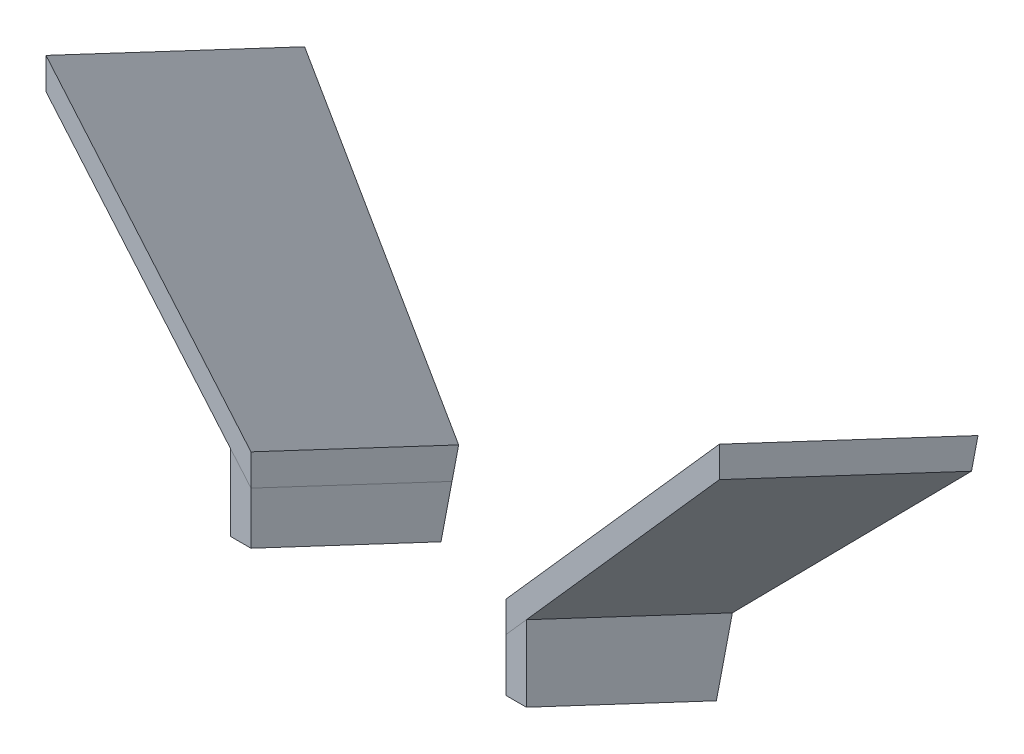
ISO-10303-21;
HEADER;
FILE_DESCRIPTION(('STEP AP214'),'2;1');
FILE_NAME('part.step','',(''),(''),'','','');
FILE_SCHEMA(('AUTOMOTIVE_DESIGN { 1 0 10303 214 1 1 1 1 }'));
ENDSEC;
DATA;
#1=APPLICATION_CONTEXT('core data for automotive mechanical design processes');
#2=APPLICATION_PROTOCOL_DEFINITION('international standard','automotive_design',2000,#1);
#3=PRODUCT_CONTEXT('',#1,'mechanical');
#4=PRODUCT('Part','Part','',(#3));
#5=PRODUCT_RELATED_PRODUCT_CATEGORY('part','',(#4));
#6=PRODUCT_DEFINITION_FORMATION('','',#4);
#7=PRODUCT_DEFINITION_CONTEXT('part definition',#1,'design');
#8=PRODUCT_DEFINITION('design','',#6,#7);
#9=PRODUCT_DEFINITION_SHAPE('','',#8);
#10=(LENGTH_UNIT() NAMED_UNIT(*) SI_UNIT(.MILLI.,.METRE.));
#11=(NAMED_UNIT(*) PLANE_ANGLE_UNIT() SI_UNIT($,.RADIAN.));
#12=(NAMED_UNIT(*) SI_UNIT($,.STERADIAN.) SOLID_ANGLE_UNIT());
#13=UNCERTAINTY_MEASURE_WITH_UNIT(LENGTH_MEASURE(1.E-05),#10,'distance_accuracy_value','');
#14=(GEOMETRIC_REPRESENTATION_CONTEXT(3) GLOBAL_UNCERTAINTY_ASSIGNED_CONTEXT((#13)) GLOBAL_UNIT_ASSIGNED_CONTEXT((#10,
#11,#12)) REPRESENTATION_CONTEXT('',''));
#15=CARTESIAN_POINT('',(0.,0.,0.));
#16=DIRECTION('',(0.,0.,1.));
#17=DIRECTION('',(1.,0.,0.));
#18=AXIS2_PLACEMENT_3D('',#15,#16,#17);
#19=CARTESIAN_POINT('',(-609.599999999917,189.561431206279,-266.208589776236));
#20=DIRECTION('',(0.,-0.228725313452446,-0.973491002005709));
#21=DIRECTION('',(-1.,0.,0.));
#22=AXIS2_PLACEMENT_3D('',#19,#20,#21);
#23=PLANE('',#22);
#24=DIRECTION('',(-1.,0.,0.));
#25=VECTOR('',#24,1.);
#26=CARTESIAN_POINT('',(-609.599999999917,-218.518699240679,-170.328652973648));
#27=LINE('',#26,#25);
#28=CARTESIAN_POINT('',(-173.037499999917,-218.518699240679,-170.328652973649));
#29=VERTEX_POINT('',#28);
#30=CARTESIAN_POINT('',(-191.293749999917,-218.518699240679,-170.328652973648));
#31=VERTEX_POINT('',#30);
#32=EDGE_CURVE('E111',#29,#31,#27,.T.);
#33=ORIENTED_EDGE('',*,*,#32,.T.);
#34=DIRECTION('',(0.,-0.973491002005709,0.228725313452446));
#35=VECTOR('',#34,1.);
#36=CARTESIAN_POINT('',(-191.293749999917,-105.971152820937,-196.772115501932));
#37=LINE('',#36,#35);
#38=CARTESIAN_POINT('',(-191.293749999917,-175.978960137592,-180.323522099806));
#39=VERTEX_POINT('',#38);
#40=EDGE_CURVE('E100',#39,#31,#37,.T.);
#41=ORIENTED_EDGE('',*,*,#40,.F.);
#42=DIRECTION('',(-0.691779980186067,-0.70296597437267,0.165164457096698));
#43=VECTOR('',#42,1.);
#44=CARTESIAN_POINT('',(-66.7796089213839,-49.451441253763,-210.051630893249));
#45=LINE('',#44,#43);
#46=CARTESIAN_POINT('',(-173.037499999917,-157.427508899888,-184.682254220184));
#47=VERTEX_POINT('',#46);
#48=EDGE_CURVE('E108',#47,#39,#45,.T.);
#49=ORIENTED_EDGE('',*,*,#48,.F.);
#50=DIRECTION('',(0.,-0.973491002005709,0.228725313452446));
#51=VECTOR('',#50,1.);
#52=CARTESIAN_POINT('',(-173.037499999917,-105.971152820937,-196.772115501932));
#53=LINE('',#52,#51);
#54=EDGE_CURVE('E12',#47,#29,#53,.T.);
#55=ORIENTED_EDGE('',*,*,#54,.T.);
#56=EDGE_LOOP('',(#33,#41,#49,#55));
#57=FACE_BOUND('',#56,.T.);
#58=ADVANCED_FACE('F58',(#57),#23,.T.);
#59=CARTESIAN_POINT('',(0.,0.,0.));
#60=DIRECTION('',(0.,0.,-1.));
#61=DIRECTION('',(1.,0.,0.));
#62=AXIS2_PLACEMENT_3D('',#59,#60,#61);
#63=PLANE('',#62);
#64=DIRECTION('',(0.,-1.,0.));
#65=VECTOR('',#64,1.);
#66=CARTESIAN_POINT('',(-173.037499999917,0.,0.));
#67=LINE('',#66,#65);
#68=CARTESIAN_POINT('',(-173.037499999917,-70.4358591762382,0.));
#69=VERTEX_POINT('',#68);
#70=CARTESIAN_POINT('',(-173.037499999917,-138.364039017786,0.));
#71=VERTEX_POINT('',#70);
#72=EDGE_CURVE('E106',#69,#71,#67,.T.);
#73=ORIENTED_EDGE('',*,*,#72,.F.);
#74=DIRECTION('',(-0.663167433478709,-0.748471078381297,0.));
#75=VECTOR('',#74,1.);
#76=CARTESIAN_POINT('',(-61.9754982176188,54.9121178876129,0.));
#77=LINE('',#76,#75);
#78=CARTESIAN_POINT('',(-191.293749999917,-91.040422118995,0.));
#79=VERTEX_POINT('',#78);
#80=EDGE_CURVE('E66',#69,#79,#77,.T.);
#81=ORIENTED_EDGE('',*,*,#80,.T.);
#82=DIRECTION('',(0.,-1.,0.));
#83=VECTOR('',#82,1.);
#84=CARTESIAN_POINT('',(-191.293749999917,1.19448110160142E-13,0.));
#85=LINE('',#84,#83);
#86=CARTESIAN_POINT('',(-191.293749999917,-138.364039017786,1.22910208005818E-13));
#87=VERTEX_POINT('',#86);
#88=EDGE_CURVE('E103',#79,#87,#85,.T.);
#89=ORIENTED_EDGE('',*,*,#88,.T.);
#90=DIRECTION('',(1.,0.,0.));
#91=VECTOR('',#90,1.);
#92=CARTESIAN_POINT('',(-603.646875,-138.364039017786,3.87855656383673E-13));
#93=LINE('',#92,#91);
#94=EDGE_CURVE('E124',#87,#71,#93,.T.);
#95=ORIENTED_EDGE('',*,*,#94,.T.);
#96=EDGE_LOOP('',(#73,#81,#89,#95));
#97=FACE_BOUND('',#96,.T.);
#98=ADVANCED_FACE('F132',(#97),#63,.F.);
#99=CARTESIAN_POINT('',(-191.293749999917,-119.192513358351,-253.04431084039));
#100=DIRECTION('',(1.,0.,0.));
#101=DIRECTION('',(0.,1.,0.));
#102=AXIS2_PLACEMENT_3D('',#99,#100,#101);
#103=PLANE('',#102);
#104=ORIENTED_EDGE('',*,*,#88,.F.);
#105=DIRECTION('',(0.,0.426127276803473,0.904663221295116));
#106=VECTOR('',#105,1.);
#107=CARTESIAN_POINT('',(-191.293749999917,-210.232935477346,-253.04431084039));
#108=LINE('',#107,#106);
#109=EDGE_CURVE('E61',#39,#79,#108,.T.);
#110=ORIENTED_EDGE('',*,*,#109,.F.);
#111=ORIENTED_EDGE('',*,*,#40,.T.);
#112=DIRECTION('',(0.,-0.42579703632988,-0.904818702200994));
#113=VECTOR('',#112,1.);
#114=CARTESIAN_POINT('',(-191.293749999917,-232.378341091693,-199.780391907053));
#115=LINE('',#114,#113);
#116=EDGE_CURVE('E121',#87,#31,#115,.T.);
#117=ORIENTED_EDGE('',*,*,#116,.F.);
#118=EDGE_LOOP('',(#104,#110,#111,#117));
#119=FACE_BOUND('',#118,.T.);
#120=ADVANCED_FACE('F97',(#119),#103,.F.);
#121=CARTESIAN_POINT('',(-61.975498217619,-64.2803954707384,-253.04431084039));
#122=DIRECTION('',(0.714426177411708,-0.633002647889575,0.298165867922002));
#123=DIRECTION('',(0.663167433478709,0.748471078381298,0.));
#124=AXIS2_PLACEMENT_3D('',#121,#122,#123);
#125=PLANE('',#124);
#126=ORIENTED_EDGE('',*,*,#48,.T.);
#127=ORIENTED_EDGE('',*,*,#109,.T.);
#128=ORIENTED_EDGE('',*,*,#80,.F.);
#129=DIRECTION('',(0.,0.426127276803473,0.904663221295116));
#130=VECTOR('',#129,1.);
#131=CARTESIAN_POINT('',(-173.037499999917,-189.628372534589,-253.04431084039));
#132=LINE('',#131,#130);
#133=EDGE_CURVE('E83',#47,#69,#132,.T.);
#134=ORIENTED_EDGE('',*,*,#133,.F.);
#135=EDGE_LOOP('',(#126,#127,#128,#134));
#136=FACE_BOUND('',#135,.T.);
#137=ADVANCED_FACE('F109',(#136),#125,.F.);
#138=CARTESIAN_POINT('',(-173.037499999917,-119.192513358351,-253.04431084039));
#139=DIRECTION('',(1.,0.,0.));
#140=DIRECTION('',(0.,0.,1.));
#141=AXIS2_PLACEMENT_3D('',#138,#139,#140);
#142=PLANE('',#141);
#143=DIRECTION('',(0.,-0.42579703632988,-0.904818702200994));
#144=VECTOR('',#143,1.);
#145=CARTESIAN_POINT('',(-173.037499999917,-138.364039017786,1.11180188154635E-13));
#146=LINE('',#145,#144);
#147=EDGE_CURVE('E74',#71,#29,#146,.T.);
#148=ORIENTED_EDGE('',*,*,#147,.T.);
#149=ORIENTED_EDGE('',*,*,#54,.F.);
#150=ORIENTED_EDGE('',*,*,#133,.T.);
#151=ORIENTED_EDGE('',*,*,#72,.T.);
#152=EDGE_LOOP('',(#148,#149,#150,#151));
#153=FACE_BOUND('',#152,.T.);
#154=ADVANCED_FACE('F127',(#153),#142,.T.);
#155=CARTESIAN_POINT('',(-603.646875,-138.364039017786,3.87855656383673E-13));
#156=DIRECTION('',(0.,0.904818702200994,-0.42579703632988));
#157=DIRECTION('',(0.,-0.42579703632988,-0.904818702200994));
#158=AXIS2_PLACEMENT_3D('',#155,#156,#157);
#159=PLANE('',#158);
#160=ORIENTED_EDGE('',*,*,#32,.F.);
#161=ORIENTED_EDGE('',*,*,#147,.F.);
#162=ORIENTED_EDGE('',*,*,#94,.F.);
#163=ORIENTED_EDGE('',*,*,#116,.T.);
#164=EDGE_LOOP('',(#160,#161,#162,#163));
#165=FACE_BOUND('',#164,.T.);
#166=ADVANCED_FACE('F130',(#165),#159,.F.);
#167=CLOSED_SHELL('',(#58,#98,#120,#137,#154,#166));
#168=MANIFOLD_SOLID_BREP('B2',#167);
#169=CARTESIAN_POINT('',(-288.754784271006,-364.952575901978,-253.04431084039));
#170=DIRECTION('',(0.728338497084429,0.619891078335886,-0.291989870824946));
#171=DIRECTION('',(-0.648135927567824,0.761524667621343,0.));
#172=AXIS2_PLACEMENT_3D('',#169,#170,#171);
#173=PLANE('',#172);
#174=DIRECTION('',(0.,0.426127276803473,0.904663221295116));
#175=VECTOR('',#174,1.);
#176=CARTESIAN_POINT('',(-438.149999999917,-189.42127581019,-253.04431084039));
#177=LINE('',#176,#175);
#178=CARTESIAN_POINT('',(-438.149999999917,-157.241048027369,-184.726063892205));
#179=VERTEX_POINT('',#178);
#180=CARTESIAN_POINT('',(-438.149999999917,-70.2287624518382,0.));
#181=VERTEX_POINT('',#180);
#182=EDGE_CURVE('E252',#179,#181,#177,.T.);
#183=ORIENTED_EDGE('',*,*,#182,.T.);
#184=DIRECTION('',(0.648135927567824,-0.761524667621343,0.));
#185=VECTOR('',#184,1.);
#186=CARTESIAN_POINT('',(-288.754784271006,-245.760062543627,0.));
#187=LINE('',#186,#185);
#188=CARTESIAN_POINT('',(-419.893749999917,-91.6788690142571,0.));
#189=VERTEX_POINT('',#188);
#190=EDGE_CURVE('E249',#181,#189,#187,.T.);
#191=ORIENTED_EDGE('',*,*,#190,.T.);
#192=DIRECTION('',(0.,0.426127276803473,0.904663221295116));
#193=VECTOR('',#192,1.);
#194=CARTESIAN_POINT('',(-419.893749999917,-210.871382372608,-253.04431084039));
#195=LINE('',#194,#193);
#196=CARTESIAN_POINT('',(-419.893749999917,-176.553789920598,-180.188463715056));
#197=VERTEX_POINT('',#196);
#198=EDGE_CURVE('E255',#197,#189,#195,.T.);
#199=ORIENTED_EDGE('',*,*,#198,.F.);
#200=DIRECTION('',(0.677150882640662,-0.716337704578502,0.1683061945924));
#201=VECTOR('',#200,1.);
#202=CARTESIAN_POINT('',(-276.679094390703,-328.056298875526,-144.592388581179));
#203=LINE('',#202,#201);
#204=EDGE_CURVE('E245',#179,#197,#203,.T.);
#205=ORIENTED_EDGE('',*,*,#204,.F.);
#206=EDGE_LOOP('',(#183,#191,#199,#205));
#207=FACE_BOUND('',#206,.T.);
#208=ADVANCED_FACE('F192',(#207),#173,.T.);
#209=CARTESIAN_POINT('',(-438.149999999917,-119.192513358351,-253.04431084039));
#210=DIRECTION('',(1.,0.,0.));
#211=DIRECTION('',(0.,0.,1.));
#212=AXIS2_PLACEMENT_3D('',#209,#210,#211);
#213=PLANE('',#212);
#214=DIRECTION('',(0.,-1.,0.));
#215=VECTOR('',#214,1.);
#216=CARTESIAN_POINT('',(-438.149999999917,0.,0.));
#217=LINE('',#216,#215);
#218=CARTESIAN_POINT('',(-438.149999999917,-138.364039017786,2.81520476428332E-13));
#219=VERTEX_POINT('',#218);
#220=EDGE_CURVE('E242',#181,#219,#217,.T.);
#221=ORIENTED_EDGE('',*,*,#220,.F.);
#222=ORIENTED_EDGE('',*,*,#182,.F.);
#223=DIRECTION('',(0.,-0.973491002005709,0.228725313452446));
#224=VECTOR('',#223,1.);
#225=CARTESIAN_POINT('',(-438.149999999917,-105.971152820937,-196.772115501932));
#226=LINE('',#225,#224);
#227=CARTESIAN_POINT('',(-438.149999999917,-218.518699240679,-170.328652973648));
#228=VERTEX_POINT('',#227);
#229=EDGE_CURVE('E244',#179,#228,#226,.T.);
#230=ORIENTED_EDGE('',*,*,#229,.T.);
#231=DIRECTION('',(0.,-0.42579703632988,-0.904818702200994));
#232=VECTOR('',#231,1.);
#233=CARTESIAN_POINT('',(-438.149999999917,-232.378341091693,-199.780391907053));
#234=LINE('',#233,#232);
#235=EDGE_CURVE('E232',#219,#228,#234,.T.);
#236=ORIENTED_EDGE('',*,*,#235,.F.);
#237=EDGE_LOOP('',(#221,#222,#230,#236));
#238=FACE_BOUND('',#237,.T.);
#239=ADVANCED_FACE('F240',(#238),#213,.F.);
#240=CARTESIAN_POINT('',(-419.893749999917,-119.192513358351,-253.04431084039));
#241=DIRECTION('',(-1.,0.,0.));
#242=DIRECTION('',(0.,-1.,0.));
#243=AXIS2_PLACEMENT_3D('',#240,#241,#242);
#244=PLANE('',#243);
#245=DIRECTION('',(0.,0.973491002005709,-0.228725313452446));
#246=VECTOR('',#245,1.);
#247=CARTESIAN_POINT('',(-419.893749999917,-105.971152820936,-196.772115501932));
#248=LINE('',#247,#246);
#249=CARTESIAN_POINT('',(-419.893749999917,-218.518699240679,-170.328652973648));
#250=VERTEX_POINT('',#249);
#251=EDGE_CURVE('E200',#250,#197,#248,.T.);
#252=ORIENTED_EDGE('',*,*,#251,.T.);
#253=ORIENTED_EDGE('',*,*,#198,.T.);
#254=DIRECTION('',(0.,1.,0.));
#255=VECTOR('',#254,1.);
#256=CARTESIAN_POINT('',(-419.893749999917,5.24382159956268E-13,0.));
#257=LINE('',#256,#255);
#258=CARTESIAN_POINT('',(-419.893749999917,-138.364039017786,2.69790456577149E-13));
#259=VERTEX_POINT('',#258);
#260=EDGE_CURVE('E251',#259,#189,#257,.T.);
#261=ORIENTED_EDGE('',*,*,#260,.F.);
#262=DIRECTION('',(0.,0.42579703632988,0.904818702200994));
#263=VECTOR('',#262,1.);
#264=CARTESIAN_POINT('',(-419.893749999917,-232.378341091693,-199.780391907053));
#265=LINE('',#264,#263);
#266=EDGE_CURVE('E234',#250,#259,#265,.T.);
#267=ORIENTED_EDGE('',*,*,#266,.F.);
#268=EDGE_LOOP('',(#252,#253,#261,#267));
#269=FACE_BOUND('',#268,.T.);
#270=ADVANCED_FACE('F262',(#269),#244,.F.);
#271=CARTESIAN_POINT('',(0.,0.,0.));
#272=DIRECTION('',(0.,0.,-1.));
#273=DIRECTION('',(1.,0.,0.));
#274=AXIS2_PLACEMENT_3D('',#271,#272,#273);
#275=PLANE('',#274);
#276=ORIENTED_EDGE('',*,*,#260,.T.);
#277=ORIENTED_EDGE('',*,*,#190,.F.);
#278=ORIENTED_EDGE('',*,*,#220,.T.);
#279=DIRECTION('',(1.,0.,0.));
#280=VECTOR('',#279,1.);
#281=CARTESIAN_POINT('',(-603.646875,-138.364039017786,3.87855656383673E-13));
#282=LINE('',#281,#280);
#283=EDGE_CURVE('E229',#219,#259,#282,.T.);
#284=ORIENTED_EDGE('',*,*,#283,.T.);
#285=EDGE_LOOP('',(#276,#277,#278,#284));
#286=FACE_BOUND('',#285,.T.);
#287=ADVANCED_FACE('F247',(#286),#275,.F.);
#288=CARTESIAN_POINT('',(-609.599999999917,189.561431206279,-266.208589776236));
#289=DIRECTION('',(0.,-0.228725313452446,-0.973491002005709));
#290=DIRECTION('',(-1.,0.,0.));
#291=AXIS2_PLACEMENT_3D('',#288,#289,#290);
#292=PLANE('',#291);
#293=DIRECTION('',(-1.,0.,0.));
#294=VECTOR('',#293,1.);
#295=CARTESIAN_POINT('',(-609.599999999917,-218.518699240679,-170.328652973648));
#296=LINE('',#295,#294);
#297=EDGE_CURVE('E56',#250,#228,#296,.T.);
#298=ORIENTED_EDGE('',*,*,#297,.T.);
#299=ORIENTED_EDGE('',*,*,#229,.F.);
#300=ORIENTED_EDGE('',*,*,#204,.T.);
#301=ORIENTED_EDGE('',*,*,#251,.F.);
#302=EDGE_LOOP('',(#298,#299,#300,#301));
#303=FACE_BOUND('',#302,.T.);
#304=ADVANCED_FACE('F194',(#303),#292,.T.);
#305=CARTESIAN_POINT('',(-603.646875,-138.364039017786,3.87855656383673E-13));
#306=DIRECTION('',(0.,0.904818702200994,-0.42579703632988));
#307=DIRECTION('',(0.,-0.42579703632988,-0.904818702200994));
#308=AXIS2_PLACEMENT_3D('',#305,#306,#307);
#309=PLANE('',#308);
#310=ORIENTED_EDGE('',*,*,#283,.F.);
#311=ORIENTED_EDGE('',*,*,#235,.T.);
#312=ORIENTED_EDGE('',*,*,#297,.F.);
#313=ORIENTED_EDGE('',*,*,#266,.T.);
#314=EDGE_LOOP('',(#310,#311,#312,#313));
#315=FACE_BOUND('',#314,.T.);
#316=ADVANCED_FACE('F231',(#315),#309,.F.);
#317=CLOSED_SHELL('',(#208,#239,#270,#287,#304,#316));
#318=MANIFOLD_SOLID_BREP('B6',#317);
#319=CARTESIAN_POINT('',(-61.9754982176192,-175.556296081528,-489.281745473094));
#320=DIRECTION('',(0.714426177411708,-0.633002647889575,0.298165867922002));
#321=DIRECTION('',(0.663167433478709,0.748471078381297,0.));
#322=AXIS2_PLACEMENT_3D('',#319,#320,#321);
#323=PLANE('',#322);
#324=DIRECTION('',(0.,0.426127276803473,0.904663221295116));
#325=VECTOR('',#324,1.);
#326=CARTESIAN_POINT('',(-2.31106958177186E-13,-105.608850470643,-489.281745473094));
#327=LINE('',#326,#325);
#328=CARTESIAN_POINT('',(0.,18.4079854399998,-225.995454317663));
#329=VERTEX_POINT('',#328);
#330=CARTESIAN_POINT('',(0.,124.859563498498,0.));
#331=VERTEX_POINT('',#330);
#332=EDGE_CURVE('E377',#329,#331,#327,.T.);
#333=ORIENTED_EDGE('',*,*,#332,.T.);
#334=DIRECTION('',(-0.663167433478709,-0.748471078381297,0.));
#335=VECTOR('',#334,1.);
#336=CARTESIAN_POINT('',(-61.9754982176188,54.9121178876129,0.));
#337=LINE('',#336,#335);
#338=CARTESIAN_POINT('',(-191.293749999917,-91.040422118995,0.));
#339=VERTEX_POINT('',#338);
#340=EDGE_CURVE('E390',#331,#339,#337,.T.);
#341=ORIENTED_EDGE('',*,*,#340,.T.);
#342=DIRECTION('',(0.,0.426127276803473,0.904663221295116));
#343=VECTOR('',#342,1.);
#344=CARTESIAN_POINT('',(-191.293749999917,-321.508836088136,-489.281745473094));
#345=LINE('',#344,#343);
#346=CARTESIAN_POINT('',(-191.293749999917,-175.978960137592,-180.323522099806));
#347=VERTEX_POINT('',#346);
#348=EDGE_CURVE('E329',#347,#339,#345,.T.);
#349=ORIENTED_EDGE('',*,*,#348,.F.);
#350=DIRECTION('',(-0.691779980186067,-0.70296597437267,0.165164457096698));
#351=VECTOR('',#350,1.);
#352=CARTESIAN_POINT('',(-93.9009428407817,-77.0113236889385,-203.576334526143));
#353=LINE('',#352,#351);
#354=EDGE_CURVE('E388',#329,#347,#353,.T.);
#355=ORIENTED_EDGE('',*,*,#354,.F.);
#356=EDGE_LOOP('',(#333,#341,#349,#355));
#357=FACE_BOUND('',#356,.T.);
#358=ADVANCED_FACE('F325',(#357),#323,.T.);
#359=CARTESIAN_POINT('',(7.86267116451114E-12,-230.468413969141,-489.281745473094));
#360=DIRECTION('',(1.,0.,0.));
#361=DIRECTION('',(0.,1.,0.));
#362=AXIS2_PLACEMENT_3D('',#359,#360,#361);
#363=PLANE('',#362);
#364=DIRECTION('',(0.,0.426127276803473,0.904663221295116));
#365=VECTOR('',#364,1.);
#366=CARTESIAN_POINT('',(-1.93807485853836E-12,-78.0799805678614,-489.281745473094));
#367=LINE('',#366,#365);
#368=CARTESIAN_POINT('',(-1.78144215178774E-12,43.1937811421144,-231.818968740964));
#369=VERTEX_POINT('',#368);
#370=CARTESIAN_POINT('',(-1.62370117351429E-12,152.38843340128,0.));
#371=VERTEX_POINT('',#370);
#372=EDGE_CURVE('E376',#369,#371,#367,.T.);
#373=ORIENTED_EDGE('',*,*,#372,.T.);
#374=DIRECTION('',(0.,-1.,0.));
#375=VECTOR('',#374,1.);
#376=CARTESIAN_POINT('',(8.17704484953521E-12,0.,0.));
#377=LINE('',#376,#375);
#378=EDGE_CURVE('E334',#371,#331,#377,.T.);
#379=ORIENTED_EDGE('',*,*,#378,.T.);
#380=ORIENTED_EDGE('',*,*,#332,.F.);
#381=DIRECTION('',(0.,-0.973491002005709,0.228725313452446));
#382=VECTOR('',#381,1.);
#383=CARTESIAN_POINT('',(1.27250415301033E-11,-158.824516917964,-184.354022016526));
#384=LINE('',#383,#382);
#385=EDGE_CURVE('E369',#369,#329,#384,.T.);
#386=ORIENTED_EDGE('',*,*,#385,.F.);
#387=EDGE_LOOP('',(#373,#379,#380,#386));
#388=FACE_BOUND('',#387,.T.);
#389=ADVANCED_FACE('F379',(#388),#363,.T.);
#390=CARTESIAN_POINT('',(-75.6397733423185,-163.449345624082,-489.281745473094));
#391=DIRECTION('',(-0.714426177411711,0.633002647889573,-0.298165867922001));
#392=DIRECTION('',(-0.663167433478706,-0.7484710783813,0.));
#393=AXIS2_PLACEMENT_3D('',#390,#391,#392);
#394=PLANE('',#393);
#395=DIRECTION('',(0.,0.426127276803473,0.904663221295116));
#396=VECTOR('',#395,1.);
#397=CARTESIAN_POINT('',(-191.293749999917,-293.97996618535,-489.281745473094));
#398=LINE('',#397,#396);
#399=CARTESIAN_POINT('',(-191.293749999917,-151.193164435473,-186.147036523108));
#400=VERTEX_POINT('',#399);
#401=CARTESIAN_POINT('',(-191.293749999917,-63.5115522162088,0.));
#402=VERTEX_POINT('',#401);
#403=EDGE_CURVE('E384',#400,#402,#398,.T.);
#404=ORIENTED_EDGE('',*,*,#403,.T.);
#405=DIRECTION('',(0.663167433478706,0.7484710783813,0.));
#406=VECTOR('',#405,1.);
#407=CARTESIAN_POINT('',(-75.6397733423182,67.0190683450588,0.));
#408=LINE('',#407,#406);
#409=EDGE_CURVE('E383',#402,#371,#408,.T.);
#410=ORIENTED_EDGE('',*,*,#409,.T.);
#411=ORIENTED_EDGE('',*,*,#372,.F.);
#412=DIRECTION('',(0.691779980186064,0.702965974372673,-0.165164457096699));
#413=VECTOR('',#412,1.);
#414=CARTESIAN_POINT('',(-107.271186461572,-65.8119667443571,-206.207664884963));
#415=LINE('',#414,#413);
#416=EDGE_CURVE('E372',#400,#369,#415,.T.);
#417=ORIENTED_EDGE('',*,*,#416,.F.);
#418=EDGE_LOOP('',(#404,#410,#411,#417));
#419=FACE_BOUND('',#418,.T.);
#420=ADVANCED_FACE('F382',(#419),#394,.T.);
#421=CARTESIAN_POINT('',(-191.293749999917,-230.468413969141,-489.281745473094));
#422=DIRECTION('',(1.,0.,0.));
#423=DIRECTION('',(0.,1.,0.));
#424=AXIS2_PLACEMENT_3D('',#421,#422,#423);
#425=PLANE('',#424);
#426=DIRECTION('',(0.,-0.973491002005709,0.228725313452446));
#427=VECTOR('',#426,1.);
#428=CARTESIAN_POINT('',(-191.293749999917,-158.824516917964,-184.354022016526));
#429=LINE('',#428,#427);
#430=EDGE_CURVE('E190',#400,#347,#429,.T.);
#431=ORIENTED_EDGE('',*,*,#430,.T.);
#432=ORIENTED_EDGE('',*,*,#348,.T.);
#433=DIRECTION('',(0.,-1.,0.));
#434=VECTOR('',#433,1.);
#435=CARTESIAN_POINT('',(-191.293749999917,1.19448110160142E-13,0.));
#436=LINE('',#435,#434);
#437=EDGE_CURVE('E346',#402,#339,#436,.T.);
#438=ORIENTED_EDGE('',*,*,#437,.F.);
#439=ORIENTED_EDGE('',*,*,#403,.F.);
#440=EDGE_LOOP('',(#431,#432,#438,#439));
#441=FACE_BOUND('',#440,.T.);
#442=ADVANCED_FACE('F398',(#441),#425,.F.);
#443=CARTESIAN_POINT('',(0.,0.,0.));
#444=DIRECTION('',(0.,0.,-1.));
#445=DIRECTION('',(1.,0.,0.));
#446=AXIS2_PLACEMENT_3D('',#443,#444,#445);
#447=PLANE('',#446);
#448=ORIENTED_EDGE('',*,*,#340,.F.);
#449=ORIENTED_EDGE('',*,*,#378,.F.);
#450=ORIENTED_EDGE('',*,*,#409,.F.);
#451=ORIENTED_EDGE('',*,*,#437,.T.);
#452=EDGE_LOOP('',(#448,#449,#450,#451));
#453=FACE_BOUND('',#452,.T.);
#454=ADVANCED_FACE('F396',(#453),#447,.F.);
#455=CARTESIAN_POINT('',(-609.599999999917,189.561431206279,-266.208589776236));
#456=DIRECTION('',(0.,-0.228725313452446,-0.973491002005709));
#457=DIRECTION('',(-1.,0.,0.));
#458=AXIS2_PLACEMENT_3D('',#455,#456,#457);
#459=PLANE('',#458);
#460=ORIENTED_EDGE('',*,*,#354,.T.);
#461=ORIENTED_EDGE('',*,*,#430,.F.);
#462=ORIENTED_EDGE('',*,*,#416,.T.);
#463=ORIENTED_EDGE('',*,*,#385,.T.);
#464=EDGE_LOOP('',(#460,#461,#462,#463));
#465=FACE_BOUND('',#464,.T.);
#466=ADVANCED_FACE('F327',(#465),#459,.T.);
#467=CLOSED_SHELL('',(#358,#389,#420,#442,#454,#466));
#468=MANIFOLD_SOLID_BREP('B50',#467);
#469=CARTESIAN_POINT('',(-288.754784270996,-476.228476512772,-489.281745473094));
#470=DIRECTION('',(-0.728338497084411,-0.619891078335903,0.291989870824954));
#471=DIRECTION('',(0.648135927567844,-0.761524667621326,0.));
#472=AXIS2_PLACEMENT_3D('',#469,#470,#471);
#473=PLANE('',#472);
#474=DIRECTION('',(0.,0.426127276803473,0.904663221295116));
#475=VECTOR('',#474,1.);
#476=CARTESIAN_POINT('',(-419.893749999917,-322.147282983398,-489.281745473094));
#477=LINE('',#476,#475);
#478=CARTESIAN_POINT('',(-419.893749999917,-176.553789920598,-180.188463715056));
#479=VERTEX_POINT('',#478);
#480=CARTESIAN_POINT('',(-419.893749999917,-91.6788690142571,0.));
#481=VERTEX_POINT('',#480);
#482=EDGE_CURVE('E511',#479,#481,#477,.T.);
#483=ORIENTED_EDGE('',*,*,#482,.T.);
#484=DIRECTION('',(-0.648135927567844,0.761524667621326,0.));
#485=VECTOR('',#484,1.);
#486=CARTESIAN_POINT('',(-288.754784270995,-245.76006254363,0.));
#487=LINE('',#486,#485);
#488=CARTESIAN_POINT('',(-603.646874999999,124.221116603221,0.));
#489=VERTEX_POINT('',#488);
#490=EDGE_CURVE('E502',#481,#489,#487,.T.);
#491=ORIENTED_EDGE('',*,*,#490,.T.);
#492=DIRECTION('',(0.,0.426127276803473,0.904663221295116));
#493=VECTOR('',#492,1.);
#494=CARTESIAN_POINT('',(-603.646875,-106.24729736592,-489.281745473094));
#495=LINE('',#494,#493);
#496=CARTESIAN_POINT('',(-603.646875,17.8331556569806,-225.860395932909));
#497=VERTEX_POINT('',#496);
#498=EDGE_CURVE('E456',#497,#489,#495,.T.);
#499=ORIENTED_EDGE('',*,*,#498,.F.);
#500=DIRECTION('',(-0.677150882640681,0.716337704578485,-0.168306194592396));
#501=VECTOR('',#500,1.);
#502=CARTESIAN_POINT('',(-249.626307481099,-356.674634573028,-137.868404703144));
#503=LINE('',#502,#501);
#504=EDGE_CURVE('E512',#479,#497,#503,.T.);
#505=ORIENTED_EDGE('',*,*,#504,.F.);
#506=EDGE_LOOP('',(#483,#491,#499,#505));
#507=FACE_BOUND('',#506,.T.);
#508=ADVANCED_FACE('F452',(#507),#473,.T.);
#509=CARTESIAN_POINT('',(-419.893749999917,-230.468413969141,-489.281745473094));
#510=DIRECTION('',(-1.,0.,0.));
#511=DIRECTION('',(0.,-1.,0.));
#512=AXIS2_PLACEMENT_3D('',#509,#510,#511);
#513=PLANE('',#512);
#514=DIRECTION('',(0.,0.973491002005709,-0.228725313452446));
#515=VECTOR('',#514,1.);
#516=CARTESIAN_POINT('',(-419.893749999917,-158.824516917964,-184.354022016526));
#517=LINE('',#516,#515);
#518=CARTESIAN_POINT('',(-419.893749999917,-151.193164435473,-186.147036523108));
#519=VERTEX_POINT('',#518);
#520=EDGE_CURVE('E497',#479,#519,#517,.T.);
#521=ORIENTED_EDGE('',*,*,#520,.T.);
#522=DIRECTION('',(0.,0.426127276803473,0.904663221295116));
#523=VECTOR('',#522,1.);
#524=CARTESIAN_POINT('',(-419.893749999917,-293.97996618535,-489.281745473094));
#525=LINE('',#524,#523);
#526=CARTESIAN_POINT('',(-419.893749999917,-63.5115522162087,0.));
#527=VERTEX_POINT('',#526);
#528=EDGE_CURVE('E522',#519,#527,#525,.T.);
#529=ORIENTED_EDGE('',*,*,#528,.T.);
#530=DIRECTION('',(0.,1.,0.));
#531=VECTOR('',#530,1.);
#532=CARTESIAN_POINT('',(-419.893749999917,5.24382159956268E-13,0.));
#533=LINE('',#532,#531);
#534=EDGE_CURVE('E490',#481,#527,#533,.T.);
#535=ORIENTED_EDGE('',*,*,#534,.F.);
#536=ORIENTED_EDGE('',*,*,#482,.F.);
#537=EDGE_LOOP('',(#521,#529,#535,#536));
#538=FACE_BOUND('',#537,.T.);
#539=ADVANCED_FACE('F526',(#538),#513,.F.);
#540=CARTESIAN_POINT('',(-274.852199557744,-464.395944985108,-489.281745473094));
#541=DIRECTION('',(-0.728338497084428,-0.619891078335886,0.291989870824946));
#542=DIRECTION('',(0.648135927567825,-0.761524667621342,0.));
#543=AXIS2_PLACEMENT_3D('',#540,#541,#542);
#544=PLANE('',#543);
#545=DIRECTION('',(-0.677150882640663,0.716337704578502,-0.1683061945924));
#546=VECTOR('',#545,1.);
#547=CARTESIAN_POINT('',(-236.010363388933,-345.717909882691,-140.442727715937));
#548=LINE('',#547,#546);
#549=CARTESIAN_POINT('',(-603.646875,43.1937811421148,-231.818968740964));
#550=VERTEX_POINT('',#549);
#551=EDGE_CURVE('E461',#519,#550,#548,.T.);
#552=ORIENTED_EDGE('',*,*,#551,.T.);
#553=DIRECTION('',(0.,0.426127276803473,0.904663221295116));
#554=VECTOR('',#553,1.);
#555=CARTESIAN_POINT('',(-603.646875,-78.0799805678611,-489.281745473094));
#556=LINE('',#555,#554);
#557=CARTESIAN_POINT('',(-603.646875,152.38843340128,0.));
#558=VERTEX_POINT('',#557);
#559=EDGE_CURVE('E506',#550,#558,#556,.T.);
#560=ORIENTED_EDGE('',*,*,#559,.T.);
#561=DIRECTION('',(-0.648135927567825,0.761524667621342,0.));
#562=VECTOR('',#561,1.);
#563=CARTESIAN_POINT('',(-274.852199557744,-233.927531015967,0.));
#564=LINE('',#563,#562);
#565=EDGE_CURVE('E504',#527,#558,#564,.T.);
#566=ORIENTED_EDGE('',*,*,#565,.F.);
#567=ORIENTED_EDGE('',*,*,#528,.F.);
#568=EDGE_LOOP('',(#552,#560,#566,#567));
#569=FACE_BOUND('',#568,.T.);
#570=ADVANCED_FACE('F524',(#569),#544,.F.);
#571=CARTESIAN_POINT('',(-603.646874999998,-230.468413969148,-489.281745473094));
#572=DIRECTION('',(1.,0.,0.));
#573=DIRECTION('',(0.,1.,0.));
#574=AXIS2_PLACEMENT_3D('',#571,#572,#573);
#575=PLANE('',#574);
#576=DIRECTION('',(0.,-0.973491002005709,0.228725313452446));
#577=VECTOR('',#576,1.);
#578=CARTESIAN_POINT('',(-603.646874999997,-158.824516917971,-184.354022016524));
#579=LINE('',#578,#577);
#580=EDGE_CURVE('E323',#550,#497,#579,.T.);
#581=ORIENTED_EDGE('',*,*,#580,.T.);
#582=ORIENTED_EDGE('',*,*,#498,.T.);
#583=DIRECTION('',(0.,-1.,0.));
#584=VECTOR('',#583,1.);
#585=CARTESIAN_POINT('',(-603.646874999998,-7.1378754054508E-12,0.));
#586=LINE('',#585,#584);
#587=EDGE_CURVE('E473',#558,#489,#586,.T.);
#588=ORIENTED_EDGE('',*,*,#587,.F.);
#589=ORIENTED_EDGE('',*,*,#559,.F.);
#590=EDGE_LOOP('',(#581,#582,#588,#589));
#591=FACE_BOUND('',#590,.T.);
#592=ADVANCED_FACE('F509',(#591),#575,.F.);
#593=CARTESIAN_POINT('',(0.,0.,0.));
#594=DIRECTION('',(0.,0.,-1.));
#595=DIRECTION('',(1.,0.,0.));
#596=AXIS2_PLACEMENT_3D('',#593,#594,#595);
#597=PLANE('',#596);
#598=ORIENTED_EDGE('',*,*,#490,.F.);
#599=ORIENTED_EDGE('',*,*,#534,.T.);
#600=ORIENTED_EDGE('',*,*,#565,.T.);
#601=ORIENTED_EDGE('',*,*,#587,.T.);
#602=EDGE_LOOP('',(#598,#599,#600,#601));
#603=FACE_BOUND('',#602,.T.);
#604=ADVANCED_FACE('F500',(#603),#597,.F.);
#605=CARTESIAN_POINT('',(-609.599999999917,189.561431206279,-266.208589776236));
#606=DIRECTION('',(0.,-0.228725313452446,-0.973491002005709));
#607=DIRECTION('',(-1.,0.,0.));
#608=AXIS2_PLACEMENT_3D('',#605,#606,#607);
#609=PLANE('',#608);
#610=ORIENTED_EDGE('',*,*,#504,.T.);
#611=ORIENTED_EDGE('',*,*,#580,.F.);
#612=ORIENTED_EDGE('',*,*,#551,.F.);
#613=ORIENTED_EDGE('',*,*,#520,.F.);
#614=EDGE_LOOP('',(#610,#611,#612,#613));
#615=FACE_BOUND('',#614,.T.);
#616=ADVANCED_FACE('F454',(#615),#609,.T.);
#617=CLOSED_SHELL('',(#508,#539,#570,#592,#604,#616));
#618=MANIFOLD_SOLID_BREP('B184',#617);
#619=ADVANCED_BREP_SHAPE_REPRESENTATION('',(#18,#168,#318,#468,#618),#14);
#620=SHAPE_DEFINITION_REPRESENTATION(#9,#619);
ENDSEC;
END-ISO-10303-21;
